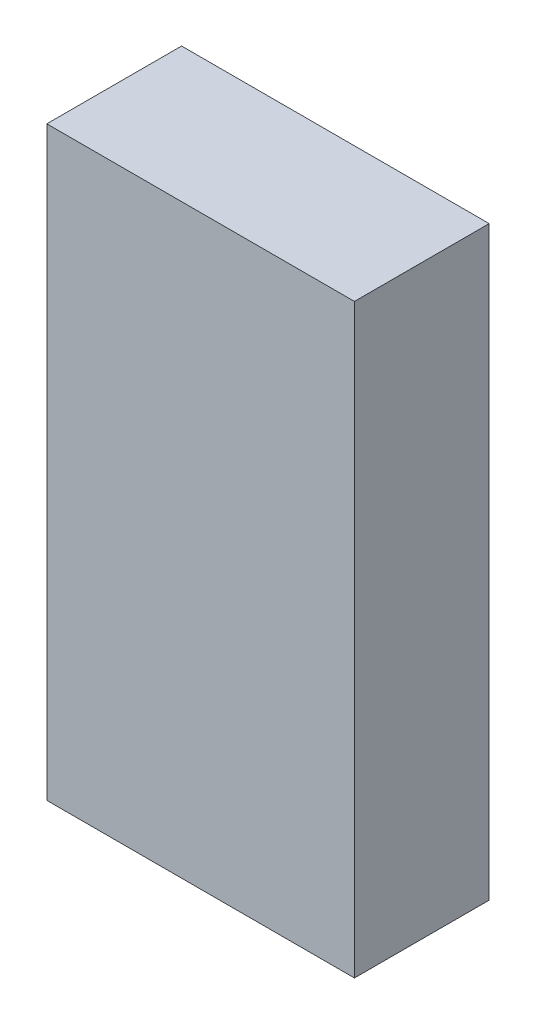
ISO-10303-21;
HEADER;
FILE_DESCRIPTION(('STEP AP214'),'2;1');
FILE_NAME('part.step','',(''),(''),'','','');
FILE_SCHEMA(('AUTOMOTIVE_DESIGN { 1 0 10303 214 1 1 1 1 }'));
ENDSEC;
DATA;
#1=APPLICATION_CONTEXT('core data for automotive mechanical design processes');
#2=APPLICATION_PROTOCOL_DEFINITION('international standard','automotive_design',2000,#1);
#3=PRODUCT_CONTEXT('',#1,'mechanical');
#4=PRODUCT('Part','Part','',(#3));
#5=PRODUCT_RELATED_PRODUCT_CATEGORY('part','',(#4));
#6=PRODUCT_DEFINITION_FORMATION('','',#4);
#7=PRODUCT_DEFINITION_CONTEXT('part definition',#1,'design');
#8=PRODUCT_DEFINITION('design','',#6,#7);
#9=PRODUCT_DEFINITION_SHAPE('','',#8);
#10=(LENGTH_UNIT() NAMED_UNIT(*) SI_UNIT(.MILLI.,.METRE.));
#11=(NAMED_UNIT(*) PLANE_ANGLE_UNIT() SI_UNIT($,.RADIAN.));
#12=(NAMED_UNIT(*) SI_UNIT($,.STERADIAN.) SOLID_ANGLE_UNIT());
#13=UNCERTAINTY_MEASURE_WITH_UNIT(LENGTH_MEASURE(1.E-05),#10,'distance_accuracy_value','');
#14=(GEOMETRIC_REPRESENTATION_CONTEXT(3) GLOBAL_UNCERTAINTY_ASSIGNED_CONTEXT((#13)) GLOBAL_UNIT_ASSIGNED_CONTEXT((#10,
#11,#12)) REPRESENTATION_CONTEXT('',''));
#15=CARTESIAN_POINT('',(0.,0.,0.));
#16=DIRECTION('',(0.,0.,1.));
#17=DIRECTION('',(1.,0.,0.));
#18=AXIS2_PLACEMENT_3D('',#15,#16,#17);
#19=CARTESIAN_POINT('',(-20.5027993173687,20.755976852218,-0.399998891135232));
#20=DIRECTION('',(0.,8.74227339409092E-08,-1.));
#21=DIRECTION('',(-1.,8.74227765734792E-08,0.));
#22=AXIS2_PLACEMENT_3D('',#19,#20,#21);
#23=PLANE('',#22);
#24=CARTESIAN_POINT('',(-20.5027993173687,20.755976852218,-0.399998891135232));
#25=DIRECTION('',(0.,8.74227339409092E-08,-1.));
#26=DIRECTION('',(-1.,8.74227765734792E-08,0.));
#27=AXIS2_PLACEMENT_3D('',#24,#25,#26);
#28=CIRCLE('',#27,0.065625);
#29=CARTESIAN_POINT('',(-20.5684243173687,20.7559768579551,-0.399998891135231));
#30=VERTEX_POINT('',#29);
#31=EDGE_CURVE('E11',#30,#30,#28,.T.);
#32=ORIENTED_EDGE('',*,*,#31,.T.);
#33=EDGE_LOOP('',(#32));
#34=FACE_BOUND('',#33,.T.);
#35=ADVANCED_FACE('F17',(#34),#23,.T.);
#36=CARTESIAN_POINT('',(-20.5027993173687,20.755976852218,-0.399998891135232));
#37=DIRECTION('',(0.,8.74227339409092E-08,-1.));
#38=DIRECTION('',(-1.,8.74227765734792E-08,0.));
#39=AXIS2_PLACEMENT_3D('',#36,#37,#38);
#40=CYLINDRICAL_SURFACE('',#39,0.065625);
#41=CARTESIAN_POINT('',(-20.5027993173687,20.7559768609602,-0.499998891135231));
#42=DIRECTION('',(0.,8.74227339409092E-08,-1.));
#43=DIRECTION('',(-1.,8.74227765734792E-08,0.));
#44=AXIS2_PLACEMENT_3D('',#41,#42,#43);
#45=CIRCLE('',#44,0.065625);
#46=CARTESIAN_POINT('',(-20.5684243173687,20.7559768666974,-0.49999889113523));
#47=VERTEX_POINT('',#46);
#48=EDGE_CURVE('E111',#47,#47,#45,.T.);
#49=ORIENTED_EDGE('',*,*,#48,.T.);
#50=EDGE_LOOP('',(#49));
#51=FACE_BOUND('',#50,.T.);
#52=ORIENTED_EDGE('',*,*,#31,.F.);
#53=EDGE_LOOP('',(#52));
#54=FACE_BOUND('',#53,.T.);
#55=ADVANCED_FACE('F169',(#51,#54),#40,.F.);
#56=CARTESIAN_POINT('',(-21.3777994769153,18.9309768972407,-0.039999050681716));
#57=DIRECTION('',(-1.,8.74227765734792E-08,0.));
#58=DIRECTION('',(0.,8.74227339409092E-08,-1.));
#59=AXIS2_PLACEMENT_3D('',#56,#57,#58);
#60=PLANE('',#59);
#61=DIRECTION('',(0.,8.74227339409092E-08,-1.));
#62=VECTOR('',#61,1.);
#63=CARTESIAN_POINT('',(-21.3777994769153,18.9309768972407,-0.039999050681716));
#64=LINE('',#63,#62);
#65=CARTESIAN_POINT('',(-21.3777994769153,18.9309768972407,-0.039999050681716));
#66=VERTEX_POINT('',#65);
#67=CARTESIAN_POINT('',(-21.3777994769153,18.9309769374551,-0.499999050681714));
#68=VERTEX_POINT('',#67);
#69=EDGE_CURVE('E76',#66,#68,#64,.T.);
#70=ORIENTED_EDGE('',*,*,#69,.F.);
#71=DIRECTION('',(8.74227765734795E-08,1.,8.74227339409088E-08));
#72=VECTOR('',#71,1.);
#73=CARTESIAN_POINT('',(-21.3777994769153,18.9309768972407,-0.039999050681716));
#74=LINE('',#73,#72);
#75=CARTESIAN_POINT('',(-21.3777993020697,20.9309768972407,-0.039998875836248));
#76=VERTEX_POINT('',#75);
#77=EDGE_CURVE('E26',#66,#76,#74,.T.);
#78=ORIENTED_EDGE('',*,*,#77,.T.);
#79=DIRECTION('',(0.,8.74227339409092E-08,-1.));
#80=VECTOR('',#79,1.);
#81=CARTESIAN_POINT('',(-21.3777993020697,20.9309768972407,-0.039998875836248));
#82=LINE('',#81,#80);
#83=CARTESIAN_POINT('',(-21.3777993020697,20.9309769374552,-0.499998875836246));
#84=VERTEX_POINT('',#83);
#85=EDGE_CURVE('E71',#76,#84,#82,.T.);
#86=ORIENTED_EDGE('',*,*,#85,.T.);
#87=DIRECTION('',(8.74227765734795E-08,1.,8.74227339409088E-08));
#88=VECTOR('',#87,1.);
#89=CARTESIAN_POINT('',(-21.3777994769153,18.9309769374551,-0.499999050681714));
#90=LINE('',#89,#88);
#91=EDGE_CURVE('E81',#68,#84,#90,.T.);
#92=ORIENTED_EDGE('',*,*,#91,.F.);
#93=EDGE_LOOP('',(#70,#78,#86,#92));
#94=FACE_BOUND('',#93,.T.);
#95=ADVANCED_FACE('F84',(#94),#60,.T.);
#96=CARTESIAN_POINT('',(-20.3277994769153,18.9309768054468,-0.0399990506817238));
#97=DIRECTION('',(0.,8.74227339409092E-08,-1.));
#98=DIRECTION('',(-1.,8.74227765734792E-08,0.));
#99=AXIS2_PLACEMENT_3D('',#96,#97,#98);
#100=PLANE('',#99);
#101=DIRECTION('',(-1.,8.74227765734792E-08,0.));
#102=VECTOR('',#101,1.);
#103=CARTESIAN_POINT('',(-20.3277993020698,20.9309768054468,-0.0399988758362558));
#104=LINE('',#103,#102);
#105=CARTESIAN_POINT('',(-20.3277993020698,20.9309768054468,-0.0399988758362558));
#106=VERTEX_POINT('',#105);
#107=EDGE_CURVE('E69',#106,#76,#104,.T.);
#108=ORIENTED_EDGE('',*,*,#107,.T.);
#109=ORIENTED_EDGE('',*,*,#77,.F.);
#110=DIRECTION('',(-1.,8.74227765734792E-08,0.));
#111=VECTOR('',#110,1.);
#112=CARTESIAN_POINT('',(-20.3277994769153,18.9309768054468,-0.0399990506817238));
#113=LINE('',#112,#111);
#114=CARTESIAN_POINT('',(-20.3277994769153,18.9309768054468,-0.0399990506817238));
#115=VERTEX_POINT('',#114);
#116=EDGE_CURVE('E64',#115,#66,#113,.T.);
#117=ORIENTED_EDGE('',*,*,#116,.F.);
#118=DIRECTION('',(8.74227765734795E-08,1.,8.74227339409088E-08));
#119=VECTOR('',#118,1.);
#120=CARTESIAN_POINT('',(-20.3277994769153,18.9309768054468,-0.0399990506817238));
#121=LINE('',#120,#119);
#122=EDGE_CURVE('E93',#115,#106,#121,.T.);
#123=ORIENTED_EDGE('',*,*,#122,.T.);
#124=EDGE_LOOP('',(#108,#109,#117,#123));
#125=FACE_BOUND('',#124,.T.);
#126=ADVANCED_FACE('F68',(#125),#100,.F.);
#127=CARTESIAN_POINT('',(-20.3277993020698,20.9309768054468,-0.0399988758362558));
#128=DIRECTION('',(8.74227765734795E-08,1.,8.74227339409088E-08));
#129=DIRECTION('',(0.,8.74227339409092E-08,-1.));
#130=AXIS2_PLACEMENT_3D('',#127,#128,#129);
#131=PLANE('',#130);
#132=ORIENTED_EDGE('',*,*,#107,.F.);
#133=DIRECTION('',(0.,8.74227339409092E-08,-1.));
#134=VECTOR('',#133,1.);
#135=CARTESIAN_POINT('',(-20.3277993020698,20.9309768054468,-0.0399988758362558));
#136=LINE('',#135,#134);
#137=CARTESIAN_POINT('',(-20.3277993020698,20.9309768456612,-0.499998875836254));
#138=VERTEX_POINT('',#137);
#139=EDGE_CURVE('E135',#106,#138,#136,.T.);
#140=ORIENTED_EDGE('',*,*,#139,.T.);
#141=DIRECTION('',(-1.,8.74227765734792E-08,0.));
#142=VECTOR('',#141,1.);
#143=CARTESIAN_POINT('',(-20.3277993020698,20.9309768456612,-0.499998875836254));
#144=LINE('',#143,#142);
#145=EDGE_CURVE('E109',#138,#84,#144,.T.);
#146=ORIENTED_EDGE('',*,*,#145,.T.);
#147=ORIENTED_EDGE('',*,*,#85,.F.);
#148=EDGE_LOOP('',(#132,#140,#146,#147));
#149=FACE_BOUND('',#148,.T.);
#150=ADVANCED_FACE('F158',(#149),#131,.T.);
#151=CARTESIAN_POINT('',(-20.3277994769153,18.9309768456612,-0.499999050681722));
#152=DIRECTION('',(0.,8.74227339409092E-08,-1.));
#153=DIRECTION('',(-1.,8.74227765734792E-08,0.));
#154=AXIS2_PLACEMENT_3D('',#151,#152,#153);
#155=PLANE('',#154);
#156=ORIENTED_EDGE('',*,*,#48,.F.);
#157=EDGE_LOOP('',(#156));
#158=FACE_BOUND('',#157,.T.);
#159=DIRECTION('',(8.74227765734795E-08,1.,8.74227339409088E-08));
#160=VECTOR('',#159,1.);
#161=CARTESIAN_POINT('',(-20.3277994769153,18.9309768456612,-0.499999050681722));
#162=LINE('',#161,#160);
#163=CARTESIAN_POINT('',(-20.3277994769153,18.9309768456612,-0.499999050681722));
#164=VERTEX_POINT('',#163);
#165=EDGE_CURVE('E139',#164,#138,#162,.T.);
#166=ORIENTED_EDGE('',*,*,#165,.F.);
#167=DIRECTION('',(-1.,8.74227765734792E-08,0.));
#168=VECTOR('',#167,1.);
#169=CARTESIAN_POINT('',(-20.3277994769153,18.9309768456612,-0.499999050681722));
#170=LINE('',#169,#168);
#171=EDGE_CURVE('E82',#164,#68,#170,.T.);
#172=ORIENTED_EDGE('',*,*,#171,.T.);
#173=ORIENTED_EDGE('',*,*,#91,.T.);
#174=ORIENTED_EDGE('',*,*,#145,.F.);
#175=EDGE_LOOP('',(#166,#172,#173,#174));
#176=FACE_BOUND('',#175,.T.);
#177=ADVANCED_FACE('F156',(#158,#176),#155,.T.);
#178=CARTESIAN_POINT('',(-20.3277994769153,18.9309768054468,-0.0399990506817238));
#179=DIRECTION('',(8.74227765734795E-08,1.,8.74227339409088E-08));
#180=DIRECTION('',(0.,8.74227339409092E-08,-1.));
#181=AXIS2_PLACEMENT_3D('',#178,#179,#180);
#182=PLANE('',#181);
#183=ORIENTED_EDGE('',*,*,#69,.T.);
#184=ORIENTED_EDGE('',*,*,#171,.F.);
#185=DIRECTION('',(0.,8.74227339409092E-08,-1.));
#186=VECTOR('',#185,1.);
#187=CARTESIAN_POINT('',(-20.3277994769153,18.9309768054468,-0.0399990506817238));
#188=LINE('',#187,#186);
#189=EDGE_CURVE('E78',#115,#164,#188,.T.);
#190=ORIENTED_EDGE('',*,*,#189,.F.);
#191=ORIENTED_EDGE('',*,*,#116,.T.);
#192=EDGE_LOOP('',(#183,#184,#190,#191));
#193=FACE_BOUND('',#192,.T.);
#194=ADVANCED_FACE('F75',(#193),#182,.F.);
#195=CARTESIAN_POINT('',(-20.3277994769153,18.9309768054468,-0.0399990506817238));
#196=DIRECTION('',(-1.,8.74227765734792E-08,0.));
#197=DIRECTION('',(0.,8.74227339409092E-08,-1.));
#198=AXIS2_PLACEMENT_3D('',#195,#196,#197);
#199=PLANE('',#198);
#200=ORIENTED_EDGE('',*,*,#165,.T.);
#201=ORIENTED_EDGE('',*,*,#139,.F.);
#202=ORIENTED_EDGE('',*,*,#122,.F.);
#203=ORIENTED_EDGE('',*,*,#189,.T.);
#204=EDGE_LOOP('',(#200,#201,#202,#203));
#205=FACE_BOUND('',#204,.T.);
#206=ADVANCED_FACE('F154',(#205),#199,.F.);
#207=CLOSED_SHELL('',(#35,#55,#95,#126,#150,#177,#194,#206));
#208=MANIFOLD_SOLID_BREP('B1',#207);
#209=ADVANCED_BREP_SHAPE_REPRESENTATION('',(#18,#208),#14);
#210=SHAPE_DEFINITION_REPRESENTATION(#9,#209);
ENDSEC;
END-ISO-10303-21;
